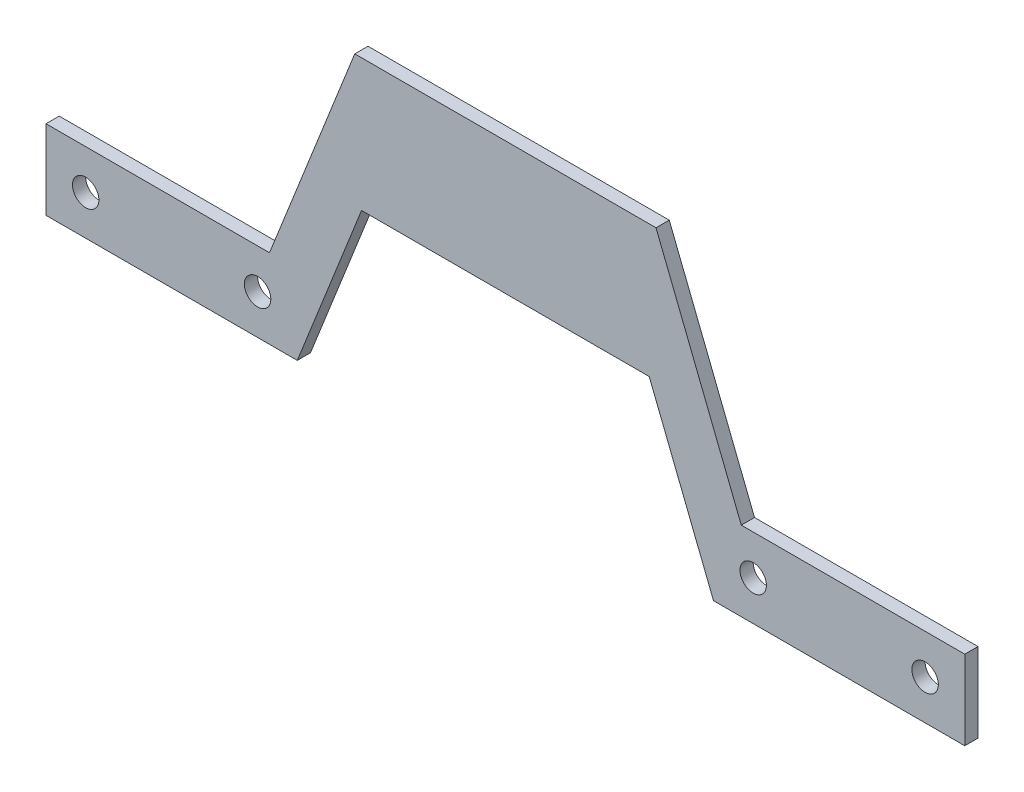
ISO-10303-21;
HEADER;
FILE_DESCRIPTION(('STEP AP214'),'2;1');
FILE_NAME('part.step','',(''),(''),'','','');
FILE_SCHEMA(('AUTOMOTIVE_DESIGN { 1 0 10303 214 1 1 1 1 }'));
ENDSEC;
DATA;
#1=APPLICATION_CONTEXT('core data for automotive mechanical design processes');
#2=APPLICATION_PROTOCOL_DEFINITION('international standard','automotive_design',2000,#1);
#3=PRODUCT_CONTEXT('',#1,'mechanical');
#4=PRODUCT('Part','Part','',(#3));
#5=PRODUCT_RELATED_PRODUCT_CATEGORY('part','',(#4));
#6=PRODUCT_DEFINITION_FORMATION('','',#4);
#7=PRODUCT_DEFINITION_CONTEXT('part definition',#1,'design');
#8=PRODUCT_DEFINITION('design','',#6,#7);
#9=PRODUCT_DEFINITION_SHAPE('','',#8);
#10=(LENGTH_UNIT() NAMED_UNIT(*) SI_UNIT(.MILLI.,.METRE.));
#11=(NAMED_UNIT(*) PLANE_ANGLE_UNIT() SI_UNIT($,.RADIAN.));
#12=(NAMED_UNIT(*) SI_UNIT($,.STERADIAN.) SOLID_ANGLE_UNIT());
#13=UNCERTAINTY_MEASURE_WITH_UNIT(LENGTH_MEASURE(1.E-05),#10,'distance_accuracy_value','');
#14=(GEOMETRIC_REPRESENTATION_CONTEXT(3) GLOBAL_UNCERTAINTY_ASSIGNED_CONTEXT((#13)) GLOBAL_UNIT_ASSIGNED_CONTEXT((#10,
#11,#12)) REPRESENTATION_CONTEXT('',''));
#15=CARTESIAN_POINT('',(0.,0.,0.));
#16=DIRECTION('',(0.,0.,1.));
#17=DIRECTION('',(1.,0.,0.));
#18=AXIS2_PLACEMENT_3D('',#15,#16,#17);
#19=CARTESIAN_POINT('',(0.,-5.04499277838993,2.));
#20=DIRECTION('',(0.,1.,0.));
#21=DIRECTION('',(-1.,0.,0.));
#22=AXIS2_PLACEMENT_3D('',#19,#20,#21);
#23=PLANE('',#22);
#24=DIRECTION('',(1.,0.,0.));
#25=VECTOR('',#24,1.);
#26=CARTESIAN_POINT('',(0.,-5.04499277838993,0.));
#27=LINE('',#26,#25);
#28=CARTESIAN_POINT('',(-21.7521345935326,-5.04499277838993,0.));
#29=VERTEX_POINT('',#28);
#30=CARTESIAN_POINT('',(21.7521345935326,-5.04499277838993,0.));
#31=VERTEX_POINT('',#30);
#32=EDGE_CURVE('E173',#29,#31,#27,.T.);
#33=ORIENTED_EDGE('',*,*,#32,.T.);
#34=DIRECTION('',(0.,0.,-1.));
#35=VECTOR('',#34,1.);
#36=CARTESIAN_POINT('',(21.7521345935326,-5.04499277838993,2.));
#37=LINE('',#36,#35);
#38=CARTESIAN_POINT('',(21.7521345935326,-5.04499277838993,2.));
#39=VERTEX_POINT('',#38);
#40=EDGE_CURVE('E11',#39,#31,#37,.T.);
#41=ORIENTED_EDGE('',*,*,#40,.F.);
#42=DIRECTION('',(1.,0.,0.));
#43=VECTOR('',#42,1.);
#44=CARTESIAN_POINT('',(0.,-5.04499277838993,2.));
#45=LINE('',#44,#43);
#46=CARTESIAN_POINT('',(-21.7521345935326,-5.04499277838993,2.));
#47=VERTEX_POINT('',#46);
#48=EDGE_CURVE('E449',#47,#39,#45,.T.);
#49=ORIENTED_EDGE('',*,*,#48,.F.);
#50=DIRECTION('',(0.,0.,-1.));
#51=VECTOR('',#50,1.);
#52=CARTESIAN_POINT('',(-21.7521345935326,-5.04499277838993,2.));
#53=LINE('',#52,#51);
#54=EDGE_CURVE('E55',#47,#29,#53,.T.);
#55=ORIENTED_EDGE('',*,*,#54,.T.);
#56=EDGE_LOOP('',(#33,#41,#49,#55));
#57=FACE_BOUND('',#56,.T.);
#58=ADVANCED_FACE('F38',(#57),#23,.F.);
#59=CARTESIAN_POINT('',(17.0617679757607,6.77206841972319,2.));
#60=DIRECTION('',(0.929462215930239,0.368917320219652,0.));
#61=DIRECTION('',(-0.368917320219652,0.929462215930239,0.));
#62=AXIS2_PLACEMENT_3D('',#59,#60,#61);
#63=PLANE('',#62);
#64=DIRECTION('',(0.368917320219652,-0.92946221593024,0.));
#65=VECTOR('',#64,1.);
#66=CARTESIAN_POINT('',(17.0617679757607,6.77206841972319,0.));
#67=LINE('',#66,#65);
#68=CARTESIAN_POINT('',(31.4765474749486,-29.5449927783899,0.));
#69=VERTEX_POINT('',#68);
#70=EDGE_CURVE('E175',#31,#69,#67,.T.);
#71=ORIENTED_EDGE('',*,*,#70,.T.);
#72=DIRECTION('',(0.,0.,-1.));
#73=VECTOR('',#72,1.);
#74=CARTESIAN_POINT('',(31.4765474749486,-29.5449927783899,2.));
#75=LINE('',#74,#73);
#76=CARTESIAN_POINT('',(31.4765474749486,-29.5449927783899,2.));
#77=VERTEX_POINT('',#76);
#78=EDGE_CURVE('E47',#77,#69,#75,.T.);
#79=ORIENTED_EDGE('',*,*,#78,.F.);
#80=DIRECTION('',(0.368917320219652,-0.92946221593024,0.));
#81=VECTOR('',#80,1.);
#82=CARTESIAN_POINT('',(17.0617679757607,6.77206841972319,2.));
#83=LINE('',#82,#81);
#84=EDGE_CURVE('E105',#39,#77,#83,.T.);
#85=ORIENTED_EDGE('',*,*,#84,.F.);
#86=ORIENTED_EDGE('',*,*,#40,.T.);
#87=EDGE_LOOP('',(#71,#79,#85,#86));
#88=FACE_BOUND('',#87,.T.);
#89=ADVANCED_FACE('F275',(#88),#63,.F.);
#90=CARTESIAN_POINT('',(0.,-29.5449927783899,2.));
#91=DIRECTION('',(0.,1.,0.));
#92=DIRECTION('',(-1.,0.,0.));
#93=AXIS2_PLACEMENT_3D('',#90,#91,#92);
#94=PLANE('',#93);
#95=DIRECTION('',(1.,0.,0.));
#96=VECTOR('',#95,1.);
#97=CARTESIAN_POINT('',(0.,-29.5449927783899,0.));
#98=LINE('',#97,#96);
#99=CARTESIAN_POINT('',(69.4765474749486,-29.5449927783899,0.));
#100=VERTEX_POINT('',#99);
#101=EDGE_CURVE('E177',#69,#100,#98,.T.);
#102=ORIENTED_EDGE('',*,*,#101,.T.);
#103=DIRECTION('',(0.,0.,-1.));
#104=VECTOR('',#103,1.);
#105=CARTESIAN_POINT('',(69.4765474749486,-29.5449927783899,2.));
#106=LINE('',#105,#104);
#107=CARTESIAN_POINT('',(69.4765474749486,-29.5449927783899,2.));
#108=VERTEX_POINT('',#107);
#109=EDGE_CURVE('E220',#108,#100,#106,.T.);
#110=ORIENTED_EDGE('',*,*,#109,.F.);
#111=DIRECTION('',(1.,0.,0.));
#112=VECTOR('',#111,1.);
#113=CARTESIAN_POINT('',(0.,-29.5449927783899,2.));
#114=LINE('',#113,#112);
#115=EDGE_CURVE('E228',#77,#108,#114,.T.);
#116=ORIENTED_EDGE('',*,*,#115,.F.);
#117=ORIENTED_EDGE('',*,*,#78,.T.);
#118=EDGE_LOOP('',(#102,#110,#116,#117));
#119=FACE_BOUND('',#118,.T.);
#120=ADVANCED_FACE('F226',(#119),#94,.F.);
#121=CARTESIAN_POINT('',(69.4765474749486,0.,2.));
#122=DIRECTION('',(-1.,0.,0.));
#123=DIRECTION('',(0.,0.,1.));
#124=AXIS2_PLACEMENT_3D('',#121,#122,#123);
#125=PLANE('',#124);
#126=DIRECTION('',(0.,1.,0.));
#127=VECTOR('',#126,1.);
#128=CARTESIAN_POINT('',(69.4765474749486,0.,0.));
#129=LINE('',#128,#127);
#130=CARTESIAN_POINT('',(69.4765474749486,-17.5449927783899,0.));
#131=VERTEX_POINT('',#130);
#132=EDGE_CURVE('E179',#100,#131,#129,.T.);
#133=ORIENTED_EDGE('',*,*,#132,.T.);
#134=DIRECTION('',(0.,0.,-1.));
#135=VECTOR('',#134,1.);
#136=CARTESIAN_POINT('',(69.4765474749486,-17.5449927783899,2.));
#137=LINE('',#136,#135);
#138=CARTESIAN_POINT('',(69.4765474749486,-17.5449927783899,2.));
#139=VERTEX_POINT('',#138);
#140=EDGE_CURVE('E217',#139,#131,#137,.T.);
#141=ORIENTED_EDGE('',*,*,#140,.F.);
#142=DIRECTION('',(0.,1.,0.));
#143=VECTOR('',#142,1.);
#144=CARTESIAN_POINT('',(69.4765474749486,0.,2.));
#145=LINE('',#144,#143);
#146=EDGE_CURVE('E246',#108,#139,#145,.T.);
#147=ORIENTED_EDGE('',*,*,#146,.F.);
#148=ORIENTED_EDGE('',*,*,#109,.T.);
#149=EDGE_LOOP('',(#133,#141,#147,#148));
#150=FACE_BOUND('',#149,.T.);
#151=ADVANCED_FACE('F237',(#150),#125,.F.);
#152=CARTESIAN_POINT('',(0.,-17.5449927783899,2.));
#153=DIRECTION('',(0.,-1.,0.));
#154=DIRECTION('',(0.,0.,-1.));
#155=AXIS2_PLACEMENT_3D('',#152,#153,#154);
#156=PLANE('',#155);
#157=DIRECTION('',(-1.,0.,0.));
#158=VECTOR('',#157,1.);
#159=CARTESIAN_POINT('',(0.,-17.5449927783899,0.));
#160=LINE('',#159,#158);
#161=CARTESIAN_POINT('',(35.6782545740592,-17.5449927783899,0.));
#162=VERTEX_POINT('',#161);
#163=EDGE_CURVE('E181',#131,#162,#160,.T.);
#164=ORIENTED_EDGE('',*,*,#163,.T.);
#165=DIRECTION('',(0.,0.,-1.));
#166=VECTOR('',#165,1.);
#167=CARTESIAN_POINT('',(35.6782545740592,-17.5449927783899,2.));
#168=LINE('',#167,#166);
#169=CARTESIAN_POINT('',(35.6782545740592,-17.5449927783899,2.));
#170=VERTEX_POINT('',#169);
#171=EDGE_CURVE('E214',#170,#162,#168,.T.);
#172=ORIENTED_EDGE('',*,*,#171,.F.);
#173=DIRECTION('',(-1.,0.,0.));
#174=VECTOR('',#173,1.);
#175=CARTESIAN_POINT('',(0.,-17.5449927783899,2.));
#176=LINE('',#175,#174);
#177=EDGE_CURVE('E243',#139,#170,#176,.T.);
#178=ORIENTED_EDGE('',*,*,#177,.F.);
#179=ORIENTED_EDGE('',*,*,#140,.T.);
#180=EDGE_LOOP('',(#164,#172,#178,#179));
#181=FACE_BOUND('',#180,.T.);
#182=ADVANCED_FACE('F241',(#181),#156,.F.);
#183=CARTESIAN_POINT('',(24.8063593035939,9.84601142664905,2.));
#184=DIRECTION('',(-0.92946221593024,-0.368917320219651,0.));
#185=DIRECTION('',(0.368917320219651,-0.929462215930239,0.));
#186=AXIS2_PLACEMENT_3D('',#183,#184,#185);
#187=PLANE('',#186);
#188=DIRECTION('',(-0.368917320219651,0.92946221593024,0.));
#189=VECTOR('',#188,1.);
#190=CARTESIAN_POINT('',(24.8063593035939,9.84601142664905,0.));
#191=LINE('',#190,#189);
#192=CARTESIAN_POINT('',(22.7785232007523,14.9550072216101,0.));
#193=VERTEX_POINT('',#192);
#194=EDGE_CURVE('E183',#162,#193,#191,.T.);
#195=ORIENTED_EDGE('',*,*,#194,.T.);
#196=DIRECTION('',(0.,0.,-1.));
#197=VECTOR('',#196,1.);
#198=CARTESIAN_POINT('',(22.7785232007523,14.9550072216101,2.));
#199=LINE('',#198,#197);
#200=CARTESIAN_POINT('',(22.7785232007523,14.9550072216101,2.));
#201=VERTEX_POINT('',#200);
#202=EDGE_CURVE('E212',#201,#193,#199,.T.);
#203=ORIENTED_EDGE('',*,*,#202,.F.);
#204=DIRECTION('',(-0.368917320219651,0.92946221593024,0.));
#205=VECTOR('',#204,1.);
#206=CARTESIAN_POINT('',(24.8063593035939,9.84601142664905,2.));
#207=LINE('',#206,#205);
#208=EDGE_CURVE('E245',#170,#201,#207,.T.);
#209=ORIENTED_EDGE('',*,*,#208,.F.);
#210=ORIENTED_EDGE('',*,*,#171,.T.);
#211=EDGE_LOOP('',(#195,#203,#209,#210));
#212=FACE_BOUND('',#211,.T.);
#213=ADVANCED_FACE('F382',(#212),#187,.F.);
#214=CARTESIAN_POINT('',(0.,14.9550072216101,2.));
#215=DIRECTION('',(0.,1.,0.));
#216=DIRECTION('',(0.,0.,1.));
#217=AXIS2_PLACEMENT_3D('',#214,#215,#216);
#218=PLANE('',#217);
#219=DIRECTION('',(1.,0.,0.));
#220=VECTOR('',#219,1.);
#221=CARTESIAN_POINT('',(0.,14.9550072216101,0.));
#222=LINE('',#221,#220);
#223=CARTESIAN_POINT('',(-22.7785232007523,14.9550072216101,0.));
#224=VERTEX_POINT('',#223);
#225=EDGE_CURVE('E186',#224,#193,#222,.T.);
#226=ORIENTED_EDGE('',*,*,#225,.F.);
#227=DIRECTION('',(0.,0.,-1.));
#228=VECTOR('',#227,1.);
#229=CARTESIAN_POINT('',(-22.7785232007523,14.9550072216101,2.));
#230=LINE('',#229,#228);
#231=CARTESIAN_POINT('',(-22.7785232007523,14.9550072216101,2.));
#232=VERTEX_POINT('',#231);
#233=EDGE_CURVE('E210',#232,#224,#230,.T.);
#234=ORIENTED_EDGE('',*,*,#233,.F.);
#235=DIRECTION('',(1.,0.,0.));
#236=VECTOR('',#235,1.);
#237=CARTESIAN_POINT('',(0.,14.9550072216101,2.));
#238=LINE('',#237,#236);
#239=EDGE_CURVE('E248',#232,#201,#238,.T.);
#240=ORIENTED_EDGE('',*,*,#239,.T.);
#241=ORIENTED_EDGE('',*,*,#202,.T.);
#242=EDGE_LOOP('',(#226,#234,#240,#241));
#243=FACE_BOUND('',#242,.T.);
#244=ADVANCED_FACE('F373',(#243),#218,.T.);
#245=CARTESIAN_POINT('',(-24.8063593035939,9.84601142664905,2.));
#246=DIRECTION('',(-0.92946221593024,0.368917320219651,0.));
#247=DIRECTION('',(-0.368917320219651,-0.929462215930239,0.));
#248=AXIS2_PLACEMENT_3D('',#245,#246,#247);
#249=PLANE('',#248);
#250=DIRECTION('',(0.368917320219651,0.92946221593024,0.));
#251=VECTOR('',#250,1.);
#252=CARTESIAN_POINT('',(-24.8063593035939,9.84601142664905,0.));
#253=LINE('',#252,#251);
#254=CARTESIAN_POINT('',(-35.6782545740592,-17.5449927783899,0.));
#255=VERTEX_POINT('',#254);
#256=EDGE_CURVE('E189',#255,#224,#253,.T.);
#257=ORIENTED_EDGE('',*,*,#256,.F.);
#258=DIRECTION('',(0.,0.,-1.));
#259=VECTOR('',#258,1.);
#260=CARTESIAN_POINT('',(-35.6782545740592,-17.5449927783899,2.));
#261=LINE('',#260,#259);
#262=CARTESIAN_POINT('',(-35.6782545740592,-17.5449927783899,2.));
#263=VERTEX_POINT('',#262);
#264=EDGE_CURVE('E208',#263,#255,#261,.T.);
#265=ORIENTED_EDGE('',*,*,#264,.F.);
#266=DIRECTION('',(0.368917320219651,0.92946221593024,0.));
#267=VECTOR('',#266,1.);
#268=CARTESIAN_POINT('',(-24.8063593035939,9.84601142664905,2.));
#269=LINE('',#268,#267);
#270=EDGE_CURVE('E255',#263,#232,#269,.T.);
#271=ORIENTED_EDGE('',*,*,#270,.T.);
#272=ORIENTED_EDGE('',*,*,#233,.T.);
#273=EDGE_LOOP('',(#257,#265,#271,#272));
#274=FACE_BOUND('',#273,.T.);
#275=ADVANCED_FACE('F365',(#274),#249,.T.);
#276=CARTESIAN_POINT('',(0.,-17.5449927783899,2.));
#277=DIRECTION('',(0.,1.,0.));
#278=DIRECTION('',(0.,0.,1.));
#279=AXIS2_PLACEMENT_3D('',#276,#277,#278);
#280=PLANE('',#279);
#281=DIRECTION('',(1.,0.,0.));
#282=VECTOR('',#281,1.);
#283=CARTESIAN_POINT('',(0.,-17.5449927783899,0.));
#284=LINE('',#283,#282);
#285=CARTESIAN_POINT('',(-69.4765474749486,-17.5449927783899,0.));
#286=VERTEX_POINT('',#285);
#287=EDGE_CURVE('E192',#286,#255,#284,.T.);
#288=ORIENTED_EDGE('',*,*,#287,.F.);
#289=DIRECTION('',(0.,0.,-1.));
#290=VECTOR('',#289,1.);
#291=CARTESIAN_POINT('',(-69.4765474749486,-17.5449927783899,2.));
#292=LINE('',#291,#290);
#293=CARTESIAN_POINT('',(-69.4765474749486,-17.5449927783899,2.));
#294=VERTEX_POINT('',#293);
#295=EDGE_CURVE('E142',#294,#286,#292,.T.);
#296=ORIENTED_EDGE('',*,*,#295,.F.);
#297=DIRECTION('',(1.,0.,0.));
#298=VECTOR('',#297,1.);
#299=CARTESIAN_POINT('',(0.,-17.5449927783899,2.));
#300=LINE('',#299,#298);
#301=EDGE_CURVE('E153',#294,#263,#300,.T.);
#302=ORIENTED_EDGE('',*,*,#301,.T.);
#303=ORIENTED_EDGE('',*,*,#264,.T.);
#304=EDGE_LOOP('',(#288,#296,#302,#303));
#305=FACE_BOUND('',#304,.T.);
#306=ADVANCED_FACE('F259',(#305),#280,.T.);
#307=CARTESIAN_POINT('',(-69.4765474749486,0.,2.));
#308=DIRECTION('',(-1.,0.,0.));
#309=DIRECTION('',(0.,0.,1.));
#310=AXIS2_PLACEMENT_3D('',#307,#308,#309);
#311=PLANE('',#310);
#312=DIRECTION('',(0.,1.,0.));
#313=VECTOR('',#312,1.);
#314=CARTESIAN_POINT('',(-69.4765474749486,0.,0.));
#315=LINE('',#314,#313);
#316=CARTESIAN_POINT('',(-69.4765474749486,-29.5449927783899,0.));
#317=VERTEX_POINT('',#316);
#318=EDGE_CURVE('E138',#317,#286,#315,.T.);
#319=ORIENTED_EDGE('',*,*,#318,.F.);
#320=DIRECTION('',(0.,0.,-1.));
#321=VECTOR('',#320,1.);
#322=CARTESIAN_POINT('',(-69.4765474749486,-29.5449927783899,2.));
#323=LINE('',#322,#321);
#324=CARTESIAN_POINT('',(-69.4765474749486,-29.5449927783899,2.));
#325=VERTEX_POINT('',#324);
#326=EDGE_CURVE('E133',#325,#317,#323,.T.);
#327=ORIENTED_EDGE('',*,*,#326,.F.);
#328=DIRECTION('',(0.,1.,0.));
#329=VECTOR('',#328,1.);
#330=CARTESIAN_POINT('',(-69.4765474749486,0.,2.));
#331=LINE('',#330,#329);
#332=EDGE_CURVE('E136',#325,#294,#331,.T.);
#333=ORIENTED_EDGE('',*,*,#332,.T.);
#334=ORIENTED_EDGE('',*,*,#295,.T.);
#335=EDGE_LOOP('',(#319,#327,#333,#334));
#336=FACE_BOUND('',#335,.T.);
#337=ADVANCED_FACE('F135',(#336),#311,.T.);
#338=CARTESIAN_POINT('',(0.,-29.5449927783899,2.));
#339=DIRECTION('',(0.,-1.,0.));
#340=DIRECTION('',(1.,0.,0.));
#341=AXIS2_PLACEMENT_3D('',#338,#339,#340);
#342=PLANE('',#341);
#343=DIRECTION('',(-1.,0.,0.));
#344=VECTOR('',#343,1.);
#345=CARTESIAN_POINT('',(0.,-29.5449927783899,0.));
#346=LINE('',#345,#344);
#347=CARTESIAN_POINT('',(-31.4765474749486,-29.5449927783899,0.));
#348=VERTEX_POINT('',#347);
#349=EDGE_CURVE('E196',#348,#317,#346,.T.);
#350=ORIENTED_EDGE('',*,*,#349,.F.);
#351=DIRECTION('',(0.,0.,-1.));
#352=VECTOR('',#351,1.);
#353=CARTESIAN_POINT('',(-31.4765474749486,-29.5449927783899,2.));
#354=LINE('',#353,#352);
#355=CARTESIAN_POINT('',(-31.4765474749486,-29.5449927783899,2.));
#356=VERTEX_POINT('',#355);
#357=EDGE_CURVE('E93',#356,#348,#354,.T.);
#358=ORIENTED_EDGE('',*,*,#357,.F.);
#359=DIRECTION('',(-1.,0.,0.));
#360=VECTOR('',#359,1.);
#361=CARTESIAN_POINT('',(0.,-29.5449927783899,2.));
#362=LINE('',#361,#360);
#363=EDGE_CURVE('E150',#356,#325,#362,.T.);
#364=ORIENTED_EDGE('',*,*,#363,.T.);
#365=ORIENTED_EDGE('',*,*,#326,.T.);
#366=EDGE_LOOP('',(#350,#358,#364,#365));
#367=FACE_BOUND('',#366,.T.);
#368=ADVANCED_FACE('F155',(#367),#342,.T.);
#369=CARTESIAN_POINT('',(-17.0617679757607,6.77206841972319,2.));
#370=DIRECTION('',(0.929462215930239,-0.368917320219652,0.));
#371=DIRECTION('',(0.368917320219652,0.929462215930239,0.));
#372=AXIS2_PLACEMENT_3D('',#369,#370,#371);
#373=PLANE('',#372);
#374=DIRECTION('',(-0.368917320219652,-0.92946221593024,0.));
#375=VECTOR('',#374,1.);
#376=CARTESIAN_POINT('',(-17.0617679757607,6.77206841972319,0.));
#377=LINE('',#376,#375);
#378=EDGE_CURVE('E198',#29,#348,#377,.T.);
#379=ORIENTED_EDGE('',*,*,#378,.F.);
#380=ORIENTED_EDGE('',*,*,#54,.F.);
#381=DIRECTION('',(-0.368917320219652,-0.92946221593024,0.));
#382=VECTOR('',#381,1.);
#383=CARTESIAN_POINT('',(-17.0617679757607,6.77206841972319,2.));
#384=LINE('',#383,#382);
#385=EDGE_CURVE('E156',#47,#356,#384,.T.);
#386=ORIENTED_EDGE('',*,*,#385,.T.);
#387=ORIENTED_EDGE('',*,*,#357,.T.);
#388=EDGE_LOOP('',(#379,#380,#386,#387));
#389=FACE_BOUND('',#388,.T.);
#390=ADVANCED_FACE('F261',(#389),#373,.T.);
#391=CARTESIAN_POINT('',(-63.4765474749486,-23.5449927783899,2.));
#392=DIRECTION('',(0.,0.,-1.));
#393=DIRECTION('',(-1.,0.,0.));
#394=AXIS2_PLACEMENT_3D('',#391,#392,#393);
#395=CYLINDRICAL_SURFACE('',#394,2.);
#396=CARTESIAN_POINT('',(-63.4765474749486,-23.5449927783899,2.));
#397=DIRECTION('',(0.,0.,1.));
#398=DIRECTION('',(1.,0.,0.));
#399=AXIS2_PLACEMENT_3D('',#396,#397,#398);
#400=CIRCLE('',#399,2.);
#401=CARTESIAN_POINT('',(-61.4765474749486,-23.5449927783899,2.));
#402=VERTEX_POINT('',#401);
#403=EDGE_CURVE('E448',#402,#402,#400,.T.);
#404=ORIENTED_EDGE('',*,*,#403,.T.);
#405=EDGE_LOOP('',(#404));
#406=FACE_BOUND('',#405,.T.);
#407=CARTESIAN_POINT('',(-63.4765474749486,-23.5449927783899,0.));
#408=DIRECTION('',(0.,0.,1.));
#409=DIRECTION('',(1.,0.,0.));
#410=AXIS2_PLACEMENT_3D('',#407,#408,#409);
#411=CIRCLE('',#410,2.);
#412=CARTESIAN_POINT('',(-61.4765474749486,-23.5449927783899,0.));
#413=VERTEX_POINT('',#412);
#414=EDGE_CURVE('E170',#413,#413,#411,.T.);
#415=ORIENTED_EDGE('',*,*,#414,.F.);
#416=EDGE_LOOP('',(#415));
#417=FACE_BOUND('',#416,.T.);
#418=ADVANCED_FACE('F263',(#406,#417),#395,.F.);
#419=CARTESIAN_POINT('',(-37.4765474749486,-23.5449927783899,2.));
#420=DIRECTION('',(0.,0.,-1.));
#421=DIRECTION('',(-1.,0.,0.));
#422=AXIS2_PLACEMENT_3D('',#419,#420,#421);
#423=CYLINDRICAL_SURFACE('',#422,2.);
#424=CARTESIAN_POINT('',(-37.4765474749486,-23.5449927783899,2.));
#425=DIRECTION('',(0.,0.,1.));
#426=DIRECTION('',(1.,0.,0.));
#427=AXIS2_PLACEMENT_3D('',#424,#425,#426);
#428=CIRCLE('',#427,2.);
#429=CARTESIAN_POINT('',(-35.4765474749486,-23.5449927783899,2.));
#430=VERTEX_POINT('',#429);
#431=EDGE_CURVE('E292',#430,#430,#428,.T.);
#432=ORIENTED_EDGE('',*,*,#431,.T.);
#433=EDGE_LOOP('',(#432));
#434=FACE_BOUND('',#433,.T.);
#435=CARTESIAN_POINT('',(-37.4765474749486,-23.5449927783899,0.));
#436=DIRECTION('',(0.,0.,1.));
#437=DIRECTION('',(1.,0.,0.));
#438=AXIS2_PLACEMENT_3D('',#435,#436,#437);
#439=CIRCLE('',#438,2.);
#440=CARTESIAN_POINT('',(-35.4765474749486,-23.5449927783899,0.));
#441=VERTEX_POINT('',#440);
#442=EDGE_CURVE('E167',#441,#441,#439,.T.);
#443=ORIENTED_EDGE('',*,*,#442,.F.);
#444=EDGE_LOOP('',(#443));
#445=FACE_BOUND('',#444,.T.);
#446=ADVANCED_FACE('F269',(#434,#445),#423,.F.);
#447=CARTESIAN_POINT('',(37.4765474749486,-23.5449927783899,2.));
#448=DIRECTION('',(0.,0.,-1.));
#449=DIRECTION('',(-1.,0.,0.));
#450=AXIS2_PLACEMENT_3D('',#447,#448,#449);
#451=CYLINDRICAL_SURFACE('',#450,2.);
#452=CARTESIAN_POINT('',(37.4765474749486,-23.5449927783899,2.));
#453=DIRECTION('',(0.,0.,1.));
#454=DIRECTION('',(1.,0.,0.));
#455=AXIS2_PLACEMENT_3D('',#452,#453,#454);
#456=CIRCLE('',#455,2.);
#457=CARTESIAN_POINT('',(39.4765474749486,-23.5449927783899,2.));
#458=VERTEX_POINT('',#457);
#459=EDGE_CURVE('E204',#458,#458,#456,.F.);
#460=ORIENTED_EDGE('',*,*,#459,.F.);
#461=EDGE_LOOP('',(#460));
#462=FACE_BOUND('',#461,.T.);
#463=CARTESIAN_POINT('',(37.4765474749486,-23.5449927783899,0.));
#464=DIRECTION('',(0.,0.,1.));
#465=DIRECTION('',(1.,0.,0.));
#466=AXIS2_PLACEMENT_3D('',#463,#464,#465);
#467=CIRCLE('',#466,2.);
#468=CARTESIAN_POINT('',(39.4765474749486,-23.5449927783899,0.));
#469=VERTEX_POINT('',#468);
#470=EDGE_CURVE('E164',#469,#469,#467,.F.);
#471=ORIENTED_EDGE('',*,*,#470,.T.);
#472=EDGE_LOOP('',(#471));
#473=FACE_BOUND('',#472,.T.);
#474=ADVANCED_FACE('F40',(#462,#473),#451,.F.);
#475=CARTESIAN_POINT('',(63.4765474749486,-23.5449927783899,2.));
#476=DIRECTION('',(0.,0.,-1.));
#477=DIRECTION('',(-1.,0.,0.));
#478=AXIS2_PLACEMENT_3D('',#475,#476,#477);
#479=CYLINDRICAL_SURFACE('',#478,2.);
#480=CARTESIAN_POINT('',(63.4765474749486,-23.5449927783899,2.));
#481=DIRECTION('',(0.,0.,1.));
#482=DIRECTION('',(1.,0.,0.));
#483=AXIS2_PLACEMENT_3D('',#480,#481,#482);
#484=CIRCLE('',#483,2.);
#485=CARTESIAN_POINT('',(65.4765474749486,-23.5449927783899,2.));
#486=VERTEX_POINT('',#485);
#487=EDGE_CURVE('E158',#486,#486,#484,.F.);
#488=ORIENTED_EDGE('',*,*,#487,.F.);
#489=EDGE_LOOP('',(#488));
#490=FACE_BOUND('',#489,.T.);
#491=CARTESIAN_POINT('',(63.4765474749486,-23.5449927783899,0.));
#492=DIRECTION('',(0.,0.,1.));
#493=DIRECTION('',(1.,0.,0.));
#494=AXIS2_PLACEMENT_3D('',#491,#492,#493);
#495=CIRCLE('',#494,2.);
#496=CARTESIAN_POINT('',(65.4765474749486,-23.5449927783899,0.));
#497=VERTEX_POINT('',#496);
#498=EDGE_CURVE('E201',#497,#497,#495,.F.);
#499=ORIENTED_EDGE('',*,*,#498,.T.);
#500=EDGE_LOOP('',(#499));
#501=FACE_BOUND('',#500,.T.);
#502=ADVANCED_FACE('F287',(#490,#501),#479,.F.);
#503=CARTESIAN_POINT('',(0.,0.,2.));
#504=DIRECTION('',(0.,0.,1.));
#505=DIRECTION('',(1.,0.,0.));
#506=AXIS2_PLACEMENT_3D('',#503,#504,#505);
#507=PLANE('',#506);
#508=ORIENTED_EDGE('',*,*,#459,.T.);
#509=EDGE_LOOP('',(#508));
#510=FACE_BOUND('',#509,.T.);
#511=ORIENTED_EDGE('',*,*,#431,.F.);
#512=EDGE_LOOP('',(#511));
#513=FACE_BOUND('',#512,.T.);
#514=ORIENTED_EDGE('',*,*,#403,.F.);
#515=EDGE_LOOP('',(#514));
#516=FACE_BOUND('',#515,.T.);
#517=ORIENTED_EDGE('',*,*,#48,.T.);
#518=ORIENTED_EDGE('',*,*,#84,.T.);
#519=ORIENTED_EDGE('',*,*,#115,.T.);
#520=ORIENTED_EDGE('',*,*,#146,.T.);
#521=ORIENTED_EDGE('',*,*,#177,.T.);
#522=ORIENTED_EDGE('',*,*,#208,.T.);
#523=ORIENTED_EDGE('',*,*,#239,.F.);
#524=ORIENTED_EDGE('',*,*,#270,.F.);
#525=ORIENTED_EDGE('',*,*,#301,.F.);
#526=ORIENTED_EDGE('',*,*,#332,.F.);
#527=ORIENTED_EDGE('',*,*,#363,.F.);
#528=ORIENTED_EDGE('',*,*,#385,.F.);
#529=EDGE_LOOP('',(#517,#518,#519,#520,#521,#522,#523,#524,#525,#526,#527,#528));
#530=FACE_BOUND('',#529,.T.);
#531=ORIENTED_EDGE('',*,*,#487,.T.);
#532=EDGE_LOOP('',(#531));
#533=FACE_BOUND('',#532,.T.);
#534=ADVANCED_FACE('F147',(#510,#513,#516,#530,#533),#507,.T.);
#535=CARTESIAN_POINT('',(0.,0.,0.));
#536=DIRECTION('',(0.,0.,1.));
#537=DIRECTION('',(1.,0.,0.));
#538=AXIS2_PLACEMENT_3D('',#535,#536,#537);
#539=PLANE('',#538);
#540=ORIENTED_EDGE('',*,*,#470,.F.);
#541=EDGE_LOOP('',(#540));
#542=FACE_BOUND('',#541,.T.);
#543=ORIENTED_EDGE('',*,*,#442,.T.);
#544=EDGE_LOOP('',(#543));
#545=FACE_BOUND('',#544,.T.);
#546=ORIENTED_EDGE('',*,*,#414,.T.);
#547=EDGE_LOOP('',(#546));
#548=FACE_BOUND('',#547,.T.);
#549=ORIENTED_EDGE('',*,*,#32,.F.);
#550=ORIENTED_EDGE('',*,*,#378,.T.);
#551=ORIENTED_EDGE('',*,*,#349,.T.);
#552=ORIENTED_EDGE('',*,*,#318,.T.);
#553=ORIENTED_EDGE('',*,*,#287,.T.);
#554=ORIENTED_EDGE('',*,*,#256,.T.);
#555=ORIENTED_EDGE('',*,*,#225,.T.);
#556=ORIENTED_EDGE('',*,*,#194,.F.);
#557=ORIENTED_EDGE('',*,*,#163,.F.);
#558=ORIENTED_EDGE('',*,*,#132,.F.);
#559=ORIENTED_EDGE('',*,*,#101,.F.);
#560=ORIENTED_EDGE('',*,*,#70,.F.);
#561=EDGE_LOOP('',(#549,#550,#551,#552,#553,#554,#555,#556,#557,#558,#559,#560));
#562=FACE_BOUND('',#561,.T.);
#563=ORIENTED_EDGE('',*,*,#498,.F.);
#564=EDGE_LOOP('',(#563));
#565=FACE_BOUND('',#564,.T.);
#566=ADVANCED_FACE('F231',(#542,#545,#548,#562,#565),#539,.F.);
#567=CLOSED_SHELL('',(#58,#89,#120,#151,#182,#213,#244,#275,#306,#337,#368,#390,#418,#446,#474,
#502,#534,#566));
#568=MANIFOLD_SOLID_BREP('B2',#567);
#569=ADVANCED_BREP_SHAPE_REPRESENTATION('',(#18,#568),#14);
#570=SHAPE_DEFINITION_REPRESENTATION(#9,#569);
ENDSEC;
END-ISO-10303-21;
